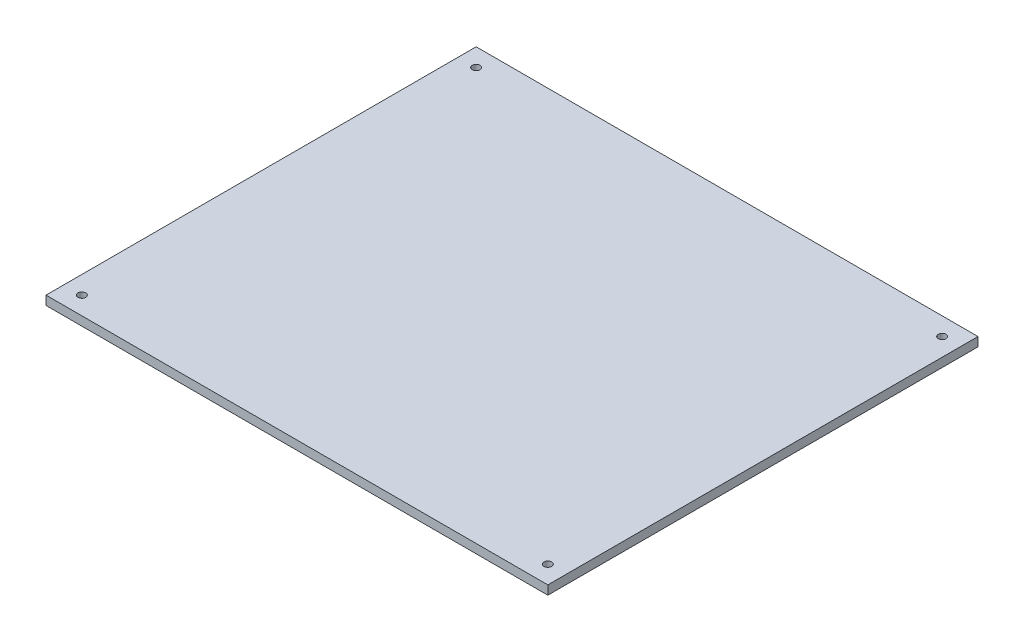
ISO-10303-21;
HEADER;
FILE_DESCRIPTION(('STEP AP214'),'2;1');
FILE_NAME('part.step','',(''),(''),'','','');
FILE_SCHEMA(('AUTOMOTIVE_DESIGN { 1 0 10303 214 1 1 1 1 }'));
ENDSEC;
DATA;
#1=APPLICATION_CONTEXT('core data for automotive mechanical design processes');
#2=APPLICATION_PROTOCOL_DEFINITION('international standard','automotive_design',2000,#1);
#3=PRODUCT_CONTEXT('',#1,'mechanical');
#4=PRODUCT('Part','Part','',(#3));
#5=PRODUCT_RELATED_PRODUCT_CATEGORY('part','',(#4));
#6=PRODUCT_DEFINITION_FORMATION('','',#4);
#7=PRODUCT_DEFINITION_CONTEXT('part definition',#1,'design');
#8=PRODUCT_DEFINITION('design','',#6,#7);
#9=PRODUCT_DEFINITION_SHAPE('','',#8);
#10=(LENGTH_UNIT() NAMED_UNIT(*) SI_UNIT(.MILLI.,.METRE.));
#11=(NAMED_UNIT(*) PLANE_ANGLE_UNIT() SI_UNIT($,.RADIAN.));
#12=(NAMED_UNIT(*) SI_UNIT($,.STERADIAN.) SOLID_ANGLE_UNIT());
#13=UNCERTAINTY_MEASURE_WITH_UNIT(LENGTH_MEASURE(1.E-05),#10,'distance_accuracy_value','');
#14=(GEOMETRIC_REPRESENTATION_CONTEXT(3) GLOBAL_UNCERTAINTY_ASSIGNED_CONTEXT((#13)) GLOBAL_UNIT_ASSIGNED_CONTEXT((#10,
#11,#12)) REPRESENTATION_CONTEXT('',''));
#15=CARTESIAN_POINT('',(0.,0.,0.));
#16=DIRECTION('',(0.,0.,1.));
#17=DIRECTION('',(1.,0.,0.));
#18=AXIS2_PLACEMENT_3D('',#15,#16,#17);
#19=CARTESIAN_POINT('',(0.,3.175,0.));
#20=DIRECTION('',(0.,-1.,0.));
#21=DIRECTION('',(0.,0.,-1.));
#22=AXIS2_PLACEMENT_3D('',#19,#20,#21);
#23=PLANE('',#22);
#24=DIRECTION('',(0.,0.,1.));
#25=VECTOR('',#24,1.);
#26=CARTESIAN_POINT('',(0.,3.175,0.));
#27=LINE('',#26,#25);
#28=CARTESIAN_POINT('',(0.,3.175,-152.4));
#29=VERTEX_POINT('',#28);
#30=CARTESIAN_POINT('',(0.,3.175,0.));
#31=VERTEX_POINT('',#30);
#32=EDGE_CURVE('E85',#29,#31,#27,.T.);
#33=ORIENTED_EDGE('',*,*,#32,.T.);
#34=DIRECTION('',(1.,0.,0.));
#35=VECTOR('',#34,1.);
#36=CARTESIAN_POINT('',(0.,3.175,0.));
#37=LINE('',#36,#35);
#38=CARTESIAN_POINT('',(177.8,3.175,0.));
#39=VERTEX_POINT('',#38);
#40=EDGE_CURVE('E80',#31,#39,#37,.T.);
#41=ORIENTED_EDGE('',*,*,#40,.T.);
#42=DIRECTION('',(0.,0.,-1.));
#43=VECTOR('',#42,1.);
#44=CARTESIAN_POINT('',(177.8,3.175,0.));
#45=LINE('',#44,#43);
#46=CARTESIAN_POINT('',(177.8,3.175,-152.4));
#47=VERTEX_POINT('',#46);
#48=EDGE_CURVE('E83',#39,#47,#45,.T.);
#49=ORIENTED_EDGE('',*,*,#48,.T.);
#50=DIRECTION('',(-1.,0.,0.));
#51=VECTOR('',#50,1.);
#52=CARTESIAN_POINT('',(0.,3.175,-152.4));
#53=LINE('',#52,#51);
#54=EDGE_CURVE('E50',#47,#29,#53,.T.);
#55=ORIENTED_EDGE('',*,*,#54,.T.);
#56=EDGE_LOOP('',(#33,#41,#49,#55));
#57=FACE_BOUND('',#56,.T.);
#58=CARTESIAN_POINT('',(6.35,3.175,-146.05));
#59=DIRECTION('',(0.,1.,0.));
#60=DIRECTION('',(0.,0.,1.));
#61=AXIS2_PLACEMENT_3D('',#58,#59,#60);
#62=CIRCLE('',#61,1.375);
#63=CARTESIAN_POINT('',(6.35,3.175,-144.675));
#64=VERTEX_POINT('',#63);
#65=EDGE_CURVE('E100',#64,#64,#62,.T.);
#66=ORIENTED_EDGE('',*,*,#65,.F.);
#67=EDGE_LOOP('',(#66));
#68=FACE_BOUND('',#67,.T.);
#69=CARTESIAN_POINT('',(171.45,3.175,-146.05));
#70=DIRECTION('',(0.,1.,0.));
#71=DIRECTION('',(0.,0.,1.));
#72=AXIS2_PLACEMENT_3D('',#69,#70,#71);
#73=CIRCLE('',#72,1.37500000000002);
#74=CARTESIAN_POINT('',(171.45,3.175,-144.675));
#75=VERTEX_POINT('',#74);
#76=EDGE_CURVE('E115',#75,#75,#73,.T.);
#77=ORIENTED_EDGE('',*,*,#76,.F.);
#78=EDGE_LOOP('',(#77));
#79=FACE_BOUND('',#78,.T.);
#80=CARTESIAN_POINT('',(6.35,3.175,-6.35));
#81=DIRECTION('',(0.,1.,0.));
#82=DIRECTION('',(0.,0.,1.));
#83=AXIS2_PLACEMENT_3D('',#80,#81,#82);
#84=CIRCLE('',#83,1.375);
#85=CARTESIAN_POINT('',(6.35,3.175,-4.975));
#86=VERTEX_POINT('',#85);
#87=EDGE_CURVE('E121',#86,#86,#84,.T.);
#88=ORIENTED_EDGE('',*,*,#87,.F.);
#89=EDGE_LOOP('',(#88));
#90=FACE_BOUND('',#89,.T.);
#91=CARTESIAN_POINT('',(171.45,3.175,-6.35));
#92=DIRECTION('',(0.,1.,0.));
#93=DIRECTION('',(0.,0.,1.));
#94=AXIS2_PLACEMENT_3D('',#91,#92,#93);
#95=CIRCLE('',#94,1.37500000000002);
#96=CARTESIAN_POINT('',(171.45,3.175,-4.97499999999998));
#97=VERTEX_POINT('',#96);
#98=EDGE_CURVE('E127',#97,#97,#95,.T.);
#99=ORIENTED_EDGE('',*,*,#98,.F.);
#100=EDGE_LOOP('',(#99));
#101=FACE_BOUND('',#100,.T.);
#102=ADVANCED_FACE('F33',(#57,#68,#79,#90,#101),#23,.F.);
#103=CARTESIAN_POINT('',(0.,0.,0.));
#104=DIRECTION('',(0.,-1.,0.));
#105=DIRECTION('',(0.,0.,-1.));
#106=AXIS2_PLACEMENT_3D('',#103,#104,#105);
#107=PLANE('',#106);
#108=CARTESIAN_POINT('',(6.35,0.,-6.35));
#109=DIRECTION('',(0.,1.,0.));
#110=DIRECTION('',(0.,0.,1.));
#111=AXIS2_PLACEMENT_3D('',#108,#109,#110);
#112=CIRCLE('',#111,1.375);
#113=CARTESIAN_POINT('',(6.35,0.,-4.975));
#114=VERTEX_POINT('',#113);
#115=EDGE_CURVE('E124',#114,#114,#112,.T.);
#116=ORIENTED_EDGE('',*,*,#115,.T.);
#117=EDGE_LOOP('',(#116));
#118=FACE_BOUND('',#117,.T.);
#119=CARTESIAN_POINT('',(6.35,0.,-146.05));
#120=DIRECTION('',(0.,1.,0.));
#121=DIRECTION('',(0.,0.,1.));
#122=AXIS2_PLACEMENT_3D('',#119,#120,#121);
#123=CIRCLE('',#122,1.375);
#124=CARTESIAN_POINT('',(6.35,0.,-144.675));
#125=VERTEX_POINT('',#124);
#126=EDGE_CURVE('E112',#125,#125,#123,.T.);
#127=ORIENTED_EDGE('',*,*,#126,.T.);
#128=EDGE_LOOP('',(#127));
#129=FACE_BOUND('',#128,.T.);
#130=DIRECTION('',(0.,0.,1.));
#131=VECTOR('',#130,1.);
#132=CARTESIAN_POINT('',(0.,0.,0.));
#133=LINE('',#132,#131);
#134=CARTESIAN_POINT('',(0.,0.,-152.4));
#135=VERTEX_POINT('',#134);
#136=CARTESIAN_POINT('',(0.,0.,0.));
#137=VERTEX_POINT('',#136);
#138=EDGE_CURVE('E97',#135,#137,#133,.T.);
#139=ORIENTED_EDGE('',*,*,#138,.F.);
#140=DIRECTION('',(-1.,0.,0.));
#141=VECTOR('',#140,1.);
#142=CARTESIAN_POINT('',(0.,0.,-152.4));
#143=LINE('',#142,#141);
#144=CARTESIAN_POINT('',(177.8,0.,-152.4));
#145=VERTEX_POINT('',#144);
#146=EDGE_CURVE('E73',#145,#135,#143,.T.);
#147=ORIENTED_EDGE('',*,*,#146,.F.);
#148=DIRECTION('',(0.,0.,-1.));
#149=VECTOR('',#148,1.);
#150=CARTESIAN_POINT('',(177.8,0.,0.));
#151=LINE('',#150,#149);
#152=CARTESIAN_POINT('',(177.8,0.,0.));
#153=VERTEX_POINT('',#152);
#154=EDGE_CURVE('E67',#153,#145,#151,.T.);
#155=ORIENTED_EDGE('',*,*,#154,.F.);
#156=DIRECTION('',(1.,0.,0.));
#157=VECTOR('',#156,1.);
#158=CARTESIAN_POINT('',(0.,0.,0.));
#159=LINE('',#158,#157);
#160=EDGE_CURVE('E89',#137,#153,#159,.T.);
#161=ORIENTED_EDGE('',*,*,#160,.F.);
#162=EDGE_LOOP('',(#139,#147,#155,#161));
#163=FACE_BOUND('',#162,.T.);
#164=CARTESIAN_POINT('',(171.45,0.,-146.05));
#165=DIRECTION('',(0.,1.,0.));
#166=DIRECTION('',(0.,0.,1.));
#167=AXIS2_PLACEMENT_3D('',#164,#165,#166);
#168=CIRCLE('',#167,1.37500000000002);
#169=CARTESIAN_POINT('',(171.45,0.,-144.675));
#170=VERTEX_POINT('',#169);
#171=EDGE_CURVE('E118',#170,#170,#168,.T.);
#172=ORIENTED_EDGE('',*,*,#171,.T.);
#173=EDGE_LOOP('',(#172));
#174=FACE_BOUND('',#173,.T.);
#175=CARTESIAN_POINT('',(171.45,0.,-6.35));
#176=DIRECTION('',(0.,1.,0.));
#177=DIRECTION('',(0.,0.,1.));
#178=AXIS2_PLACEMENT_3D('',#175,#176,#177);
#179=CIRCLE('',#178,1.37500000000002);
#180=CARTESIAN_POINT('',(171.45,0.,-4.97499999999998));
#181=VERTEX_POINT('',#180);
#182=EDGE_CURVE('E130',#181,#181,#179,.T.);
#183=ORIENTED_EDGE('',*,*,#182,.T.);
#184=EDGE_LOOP('',(#183));
#185=FACE_BOUND('',#184,.T.);
#186=ADVANCED_FACE('F108',(#118,#129,#163,#174,#185),#107,.T.);
#187=CARTESIAN_POINT('',(0.,3.175,0.));
#188=DIRECTION('',(1.,0.,0.));
#189=DIRECTION('',(0.,0.,-1.));
#190=AXIS2_PLACEMENT_3D('',#187,#188,#189);
#191=PLANE('',#190);
#192=ORIENTED_EDGE('',*,*,#138,.T.);
#193=DIRECTION('',(0.,-1.,0.));
#194=VECTOR('',#193,1.);
#195=CARTESIAN_POINT('',(0.,3.175,0.));
#196=LINE('',#195,#194);
#197=EDGE_CURVE('E11',#31,#137,#196,.T.);
#198=ORIENTED_EDGE('',*,*,#197,.F.);
#199=ORIENTED_EDGE('',*,*,#32,.F.);
#200=DIRECTION('',(0.,-1.,0.));
#201=VECTOR('',#200,1.);
#202=CARTESIAN_POINT('',(0.,3.175,-152.4));
#203=LINE('',#202,#201);
#204=EDGE_CURVE('E93',#29,#135,#203,.T.);
#205=ORIENTED_EDGE('',*,*,#204,.T.);
#206=EDGE_LOOP('',(#192,#198,#199,#205));
#207=FACE_BOUND('',#206,.T.);
#208=ADVANCED_FACE('F35',(#207),#191,.F.);
#209=CARTESIAN_POINT('',(0.,3.175,0.));
#210=DIRECTION('',(0.,0.,-1.));
#211=DIRECTION('',(-1.,0.,0.));
#212=AXIS2_PLACEMENT_3D('',#209,#210,#211);
#213=PLANE('',#212);
#214=ORIENTED_EDGE('',*,*,#160,.T.);
#215=DIRECTION('',(0.,-1.,0.));
#216=VECTOR('',#215,1.);
#217=CARTESIAN_POINT('',(177.8,3.175,0.));
#218=LINE('',#217,#216);
#219=EDGE_CURVE('E42',#39,#153,#218,.T.);
#220=ORIENTED_EDGE('',*,*,#219,.F.);
#221=ORIENTED_EDGE('',*,*,#40,.F.);
#222=ORIENTED_EDGE('',*,*,#197,.T.);
#223=EDGE_LOOP('',(#214,#220,#221,#222));
#224=FACE_BOUND('',#223,.T.);
#225=ADVANCED_FACE('F88',(#224),#213,.F.);
#226=CARTESIAN_POINT('',(177.8,3.175,0.));
#227=DIRECTION('',(-1.,0.,0.));
#228=DIRECTION('',(0.,0.,1.));
#229=AXIS2_PLACEMENT_3D('',#226,#227,#228);
#230=PLANE('',#229);
#231=ORIENTED_EDGE('',*,*,#154,.T.);
#232=DIRECTION('',(0.,-1.,0.));
#233=VECTOR('',#232,1.);
#234=CARTESIAN_POINT('',(177.8,3.175,-152.4));
#235=LINE('',#234,#233);
#236=EDGE_CURVE('E90',#47,#145,#235,.T.);
#237=ORIENTED_EDGE('',*,*,#236,.F.);
#238=ORIENTED_EDGE('',*,*,#48,.F.);
#239=ORIENTED_EDGE('',*,*,#219,.T.);
#240=EDGE_LOOP('',(#231,#237,#238,#239));
#241=FACE_BOUND('',#240,.T.);
#242=ADVANCED_FACE('F91',(#241),#230,.F.);
#243=CARTESIAN_POINT('',(0.,3.175,-152.4));
#244=DIRECTION('',(0.,0.,1.));
#245=DIRECTION('',(1.,0.,0.));
#246=AXIS2_PLACEMENT_3D('',#243,#244,#245);
#247=PLANE('',#246);
#248=ORIENTED_EDGE('',*,*,#146,.T.);
#249=ORIENTED_EDGE('',*,*,#204,.F.);
#250=ORIENTED_EDGE('',*,*,#54,.F.);
#251=ORIENTED_EDGE('',*,*,#236,.T.);
#252=EDGE_LOOP('',(#248,#249,#250,#251));
#253=FACE_BOUND('',#252,.T.);
#254=ADVANCED_FACE('F105',(#253),#247,.F.);
#255=CARTESIAN_POINT('',(6.35,3.175,-146.05));
#256=DIRECTION('',(0.,-1.,0.));
#257=DIRECTION('',(0.,0.,-1.));
#258=AXIS2_PLACEMENT_3D('',#255,#256,#257);
#259=CYLINDRICAL_SURFACE('',#258,1.375);
#260=ORIENTED_EDGE('',*,*,#65,.T.);
#261=EDGE_LOOP('',(#260));
#262=FACE_BOUND('',#261,.T.);
#263=ORIENTED_EDGE('',*,*,#126,.F.);
#264=EDGE_LOOP('',(#263));
#265=FACE_BOUND('',#264,.T.);
#266=ADVANCED_FACE('F147',(#262,#265),#259,.F.);
#267=CARTESIAN_POINT('',(171.45,3.175,-146.05));
#268=DIRECTION('',(0.,-1.,0.));
#269=DIRECTION('',(0.,0.,-1.));
#270=AXIS2_PLACEMENT_3D('',#267,#268,#269);
#271=CYLINDRICAL_SURFACE('',#270,1.37500000000002);
#272=ORIENTED_EDGE('',*,*,#76,.T.);
#273=EDGE_LOOP('',(#272));
#274=FACE_BOUND('',#273,.T.);
#275=ORIENTED_EDGE('',*,*,#171,.F.);
#276=EDGE_LOOP('',(#275));
#277=FACE_BOUND('',#276,.T.);
#278=ADVANCED_FACE('F193',(#274,#277),#271,.F.);
#279=CARTESIAN_POINT('',(6.35,3.175,-6.35));
#280=DIRECTION('',(0.,-1.,0.));
#281=DIRECTION('',(0.,0.,-1.));
#282=AXIS2_PLACEMENT_3D('',#279,#280,#281);
#283=CYLINDRICAL_SURFACE('',#282,1.375);
#284=ORIENTED_EDGE('',*,*,#87,.T.);
#285=EDGE_LOOP('',(#284));
#286=FACE_BOUND('',#285,.T.);
#287=ORIENTED_EDGE('',*,*,#115,.F.);
#288=EDGE_LOOP('',(#287));
#289=FACE_BOUND('',#288,.T.);
#290=ADVANCED_FACE('F201',(#286,#289),#283,.F.);
#291=CARTESIAN_POINT('',(171.45,3.175,-6.35));
#292=DIRECTION('',(0.,-1.,0.));
#293=DIRECTION('',(0.,0.,-1.));
#294=AXIS2_PLACEMENT_3D('',#291,#292,#293);
#295=CYLINDRICAL_SURFACE('',#294,1.37500000000002);
#296=ORIENTED_EDGE('',*,*,#98,.T.);
#297=EDGE_LOOP('',(#296));
#298=FACE_BOUND('',#297,.T.);
#299=ORIENTED_EDGE('',*,*,#182,.F.);
#300=EDGE_LOOP('',(#299));
#301=FACE_BOUND('',#300,.T.);
#302=ADVANCED_FACE('F136',(#298,#301),#295,.F.);
#303=CLOSED_SHELL('',(#102,#186,#208,#225,#242,#254,#266,#278,#290,#302));
#304=MANIFOLD_SOLID_BREP('B2',#303);
#305=ADVANCED_BREP_SHAPE_REPRESENTATION('',(#18,#304),#14);
#306=SHAPE_DEFINITION_REPRESENTATION(#9,#305);
ENDSEC;
END-ISO-10303-21;
